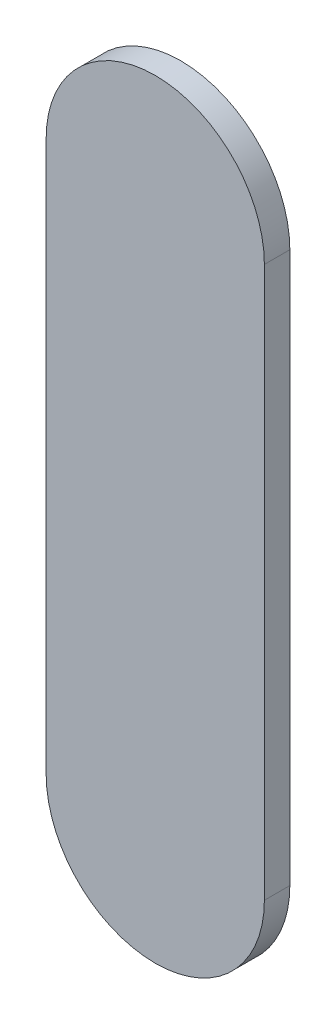
ISO-10303-21;
HEADER;
FILE_DESCRIPTION(('STEP AP214'),'2;1');
FILE_NAME('part.step','',(''),(''),'','','');
FILE_SCHEMA(('AUTOMOTIVE_DESIGN { 1 0 10303 214 1 1 1 1 }'));
ENDSEC;
DATA;
#1=APPLICATION_CONTEXT('core data for automotive mechanical design processes');
#2=APPLICATION_PROTOCOL_DEFINITION('international standard','automotive_design',2000,#1);
#3=PRODUCT_CONTEXT('',#1,'mechanical');
#4=PRODUCT('Part','Part','',(#3));
#5=PRODUCT_RELATED_PRODUCT_CATEGORY('part','',(#4));
#6=PRODUCT_DEFINITION_FORMATION('','',#4);
#7=PRODUCT_DEFINITION_CONTEXT('part definition',#1,'design');
#8=PRODUCT_DEFINITION('design','',#6,#7);
#9=PRODUCT_DEFINITION_SHAPE('','',#8);
#10=(LENGTH_UNIT() NAMED_UNIT(*) SI_UNIT(.MILLI.,.METRE.));
#11=(NAMED_UNIT(*) PLANE_ANGLE_UNIT() SI_UNIT($,.RADIAN.));
#12=(NAMED_UNIT(*) SI_UNIT($,.STERADIAN.) SOLID_ANGLE_UNIT());
#13=UNCERTAINTY_MEASURE_WITH_UNIT(LENGTH_MEASURE(1.E-05),#10,'distance_accuracy_value','');
#14=(GEOMETRIC_REPRESENTATION_CONTEXT(3) GLOBAL_UNCERTAINTY_ASSIGNED_CONTEXT((#13)) GLOBAL_UNIT_ASSIGNED_CONTEXT((#10,
#11,#12)) REPRESENTATION_CONTEXT('',''));
#15=CARTESIAN_POINT('',(0.,0.,0.));
#16=DIRECTION('',(0.,0.,1.));
#17=DIRECTION('',(1.,0.,0.));
#18=AXIS2_PLACEMENT_3D('',#15,#16,#17);
#19=CARTESIAN_POINT('',(132.318,-119.461045,1.635));
#20=DIRECTION('',(0.,0.,1.));
#21=DIRECTION('',(1.,0.,0.));
#22=AXIS2_PLACEMENT_3D('',#19,#20,#21);
#23=PLANE('',#22);
#24=DIRECTION('',(0.,1.,0.));
#25=VECTOR('',#24,1.);
#26=CARTESIAN_POINT('',(132.318,-119.461045,1.635));
#27=LINE('',#26,#25);
#28=CARTESIAN_POINT('',(132.318,-119.461045,1.635));
#29=VERTEX_POINT('',#28);
#30=CARTESIAN_POINT('',(132.318,-118.704,1.635));
#31=VERTEX_POINT('',#30);
#32=EDGE_CURVE('E90',#29,#31,#27,.T.);
#33=ORIENTED_EDGE('',*,*,#32,.T.);
#34=CARTESIAN_POINT('',(132.168,-118.704,1.635));
#35=DIRECTION('',(0.,0.,1.));
#36=DIRECTION('',(1.,0.,0.));
#37=AXIS2_PLACEMENT_3D('',#34,#35,#36);
#38=CIRCLE('',#37,0.15);
#39=CARTESIAN_POINT('',(132.018,-118.704,1.635));
#40=VERTEX_POINT('',#39);
#41=EDGE_CURVE('E107',#31,#40,#38,.T.);
#42=ORIENTED_EDGE('',*,*,#41,.T.);
#43=DIRECTION('',(0.,-1.,0.));
#44=VECTOR('',#43,1.);
#45=CARTESIAN_POINT('',(132.018,-118.704,1.635));
#46=LINE('',#45,#44);
#47=CARTESIAN_POINT('',(132.018,-119.461045,1.635));
#48=VERTEX_POINT('',#47);
#49=EDGE_CURVE('E84',#40,#48,#46,.T.);
#50=ORIENTED_EDGE('',*,*,#49,.T.);
#51=CARTESIAN_POINT('',(132.168,-119.461045,1.635));
#52=DIRECTION('',(0.,0.,1.));
#53=DIRECTION('',(-1.,0.,0.));
#54=AXIS2_PLACEMENT_3D('',#51,#52,#53);
#55=CIRCLE('',#54,0.15);
#56=EDGE_CURVE('E11',#48,#29,#55,.T.);
#57=ORIENTED_EDGE('',*,*,#56,.T.);
#58=EDGE_LOOP('',(#33,#42,#50,#57));
#59=FACE_BOUND('',#58,.T.);
#60=ADVANCED_FACE('F17',(#59),#23,.T.);
#61=CARTESIAN_POINT('',(132.318,-119.461045,1.6));
#62=DIRECTION('',(0.,0.,1.));
#63=DIRECTION('',(1.,0.,0.));
#64=AXIS2_PLACEMENT_3D('',#61,#62,#63);
#65=PLANE('',#64);
#66=CARTESIAN_POINT('',(132.168,-119.461045,1.6));
#67=DIRECTION('',(0.,0.,1.));
#68=DIRECTION('',(-1.,0.,0.));
#69=AXIS2_PLACEMENT_3D('',#66,#67,#68);
#70=CIRCLE('',#69,0.15);
#71=CARTESIAN_POINT('',(132.018,-119.461045,1.6));
#72=VERTEX_POINT('',#71);
#73=CARTESIAN_POINT('',(132.318,-119.461045,1.6));
#74=VERTEX_POINT('',#73);
#75=EDGE_CURVE('E25',#72,#74,#70,.T.);
#76=ORIENTED_EDGE('',*,*,#75,.F.);
#77=DIRECTION('',(0.,-1.,0.));
#78=VECTOR('',#77,1.);
#79=CARTESIAN_POINT('',(132.018,-118.704,1.6));
#80=LINE('',#79,#78);
#81=CARTESIAN_POINT('',(132.018,-118.704,1.6));
#82=VERTEX_POINT('',#81);
#83=EDGE_CURVE('E58',#82,#72,#80,.T.);
#84=ORIENTED_EDGE('',*,*,#83,.F.);
#85=CARTESIAN_POINT('',(132.168,-118.704,1.6));
#86=DIRECTION('',(0.,0.,1.));
#87=DIRECTION('',(1.,0.,0.));
#88=AXIS2_PLACEMENT_3D('',#85,#86,#87);
#89=CIRCLE('',#88,0.15);
#90=CARTESIAN_POINT('',(132.318,-118.704,1.6));
#91=VERTEX_POINT('',#90);
#92=EDGE_CURVE('E73',#91,#82,#89,.T.);
#93=ORIENTED_EDGE('',*,*,#92,.F.);
#94=DIRECTION('',(0.,1.,0.));
#95=VECTOR('',#94,1.);
#96=CARTESIAN_POINT('',(132.318,-119.461045,1.6));
#97=LINE('',#96,#95);
#98=EDGE_CURVE('E89',#74,#91,#97,.T.);
#99=ORIENTED_EDGE('',*,*,#98,.F.);
#100=EDGE_LOOP('',(#76,#84,#93,#99));
#101=FACE_BOUND('',#100,.T.);
#102=ADVANCED_FACE('F93',(#101),#65,.F.);
#103=CARTESIAN_POINT('',(132.168,-119.461045,1.6));
#104=DIRECTION('',(0.,0.,-1.));
#105=DIRECTION('',(-1.,0.,0.));
#106=AXIS2_PLACEMENT_3D('',#103,#104,#105);
#107=CYLINDRICAL_SURFACE('',#106,0.15);
#108=ORIENTED_EDGE('',*,*,#75,.T.);
#109=DIRECTION('',(0.,0.,1.));
#110=VECTOR('',#109,1.);
#111=CARTESIAN_POINT('',(132.318,-119.461045,1.6));
#112=LINE('',#111,#110);
#113=EDGE_CURVE('E79',#74,#29,#112,.T.);
#114=ORIENTED_EDGE('',*,*,#113,.T.);
#115=ORIENTED_EDGE('',*,*,#56,.F.);
#116=DIRECTION('',(0.,0.,1.));
#117=VECTOR('',#116,1.);
#118=CARTESIAN_POINT('',(132.018,-119.461045,1.6));
#119=LINE('',#118,#117);
#120=EDGE_CURVE('E82',#72,#48,#119,.T.);
#121=ORIENTED_EDGE('',*,*,#120,.F.);
#122=EDGE_LOOP('',(#108,#114,#115,#121));
#123=FACE_BOUND('',#122,.T.);
#124=ADVANCED_FACE('F78',(#123),#107,.T.);
#125=CARTESIAN_POINT('',(132.018,-118.704,1.6));
#126=DIRECTION('',(1.,0.,0.));
#127=DIRECTION('',(0.,1.,0.));
#128=AXIS2_PLACEMENT_3D('',#125,#126,#127);
#129=PLANE('',#128);
#130=ORIENTED_EDGE('',*,*,#83,.T.);
#131=ORIENTED_EDGE('',*,*,#120,.T.);
#132=ORIENTED_EDGE('',*,*,#49,.F.);
#133=DIRECTION('',(0.,0.,1.));
#134=VECTOR('',#133,1.);
#135=CARTESIAN_POINT('',(132.018,-118.704,1.6));
#136=LINE('',#135,#134);
#137=EDGE_CURVE('E109',#82,#40,#136,.T.);
#138=ORIENTED_EDGE('',*,*,#137,.F.);
#139=EDGE_LOOP('',(#130,#131,#132,#138));
#140=FACE_BOUND('',#139,.T.);
#141=ADVANCED_FACE('F120',(#140),#129,.F.);
#142=CARTESIAN_POINT('',(132.168,-118.704,1.6));
#143=DIRECTION('',(0.,0.,-1.));
#144=DIRECTION('',(1.,0.,0.));
#145=AXIS2_PLACEMENT_3D('',#142,#143,#144);
#146=CYLINDRICAL_SURFACE('',#145,0.15);
#147=ORIENTED_EDGE('',*,*,#92,.T.);
#148=ORIENTED_EDGE('',*,*,#137,.T.);
#149=ORIENTED_EDGE('',*,*,#41,.F.);
#150=DIRECTION('',(0.,0.,1.));
#151=VECTOR('',#150,1.);
#152=CARTESIAN_POINT('',(132.318,-118.704,1.6));
#153=LINE('',#152,#151);
#154=EDGE_CURVE('E95',#91,#31,#153,.T.);
#155=ORIENTED_EDGE('',*,*,#154,.F.);
#156=EDGE_LOOP('',(#147,#148,#149,#155));
#157=FACE_BOUND('',#156,.T.);
#158=ADVANCED_FACE('F123',(#157),#146,.T.);
#159=CARTESIAN_POINT('',(132.318,-119.461045,1.6));
#160=DIRECTION('',(-1.,0.,0.));
#161=DIRECTION('',(0.,0.,1.));
#162=AXIS2_PLACEMENT_3D('',#159,#160,#161);
#163=PLANE('',#162);
#164=ORIENTED_EDGE('',*,*,#98,.T.);
#165=ORIENTED_EDGE('',*,*,#154,.T.);
#166=ORIENTED_EDGE('',*,*,#32,.F.);
#167=ORIENTED_EDGE('',*,*,#113,.F.);
#168=EDGE_LOOP('',(#164,#165,#166,#167));
#169=FACE_BOUND('',#168,.T.);
#170=ADVANCED_FACE('F87',(#169),#163,.F.);
#171=CLOSED_SHELL('',(#60,#102,#124,#141,#158,#170));
#172=MANIFOLD_SOLID_BREP('B1',#171);
#173=ADVANCED_BREP_SHAPE_REPRESENTATION('',(#18,#172),#14);
#174=SHAPE_DEFINITION_REPRESENTATION(#9,#173);
ENDSEC;
END-ISO-10303-21;
